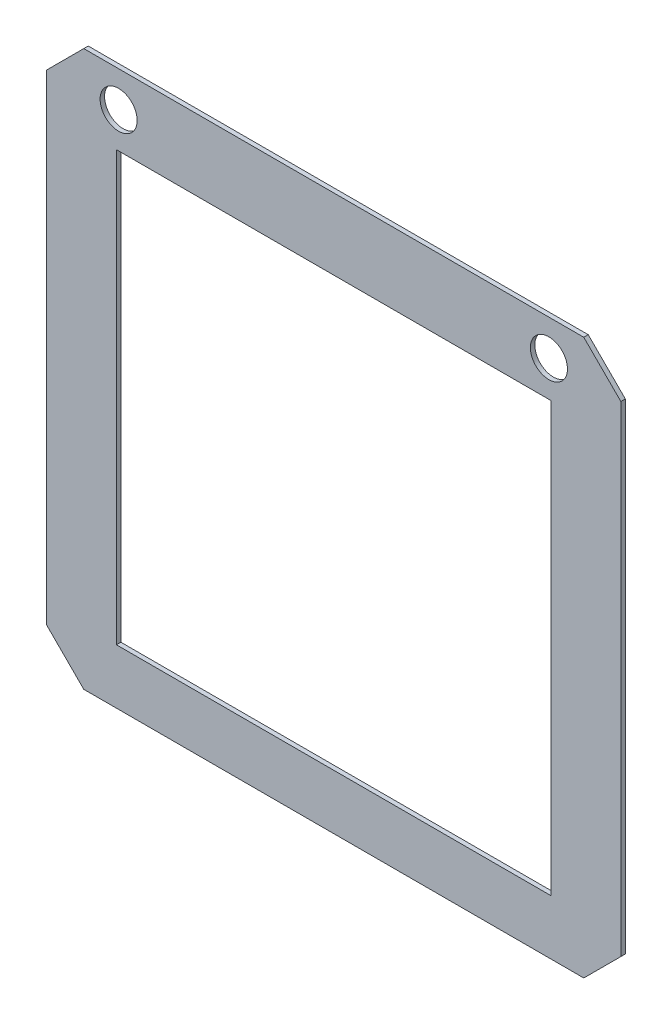
ISO-10303-21;
HEADER;
FILE_DESCRIPTION(('STEP AP214'),'2;1');
FILE_NAME('part.step','',(''),(''),'','','');
FILE_SCHEMA(('AUTOMOTIVE_DESIGN { 1 0 10303 214 1 1 1 1 }'));
ENDSEC;
DATA;
#1=APPLICATION_CONTEXT('core data for automotive mechanical design processes');
#2=APPLICATION_PROTOCOL_DEFINITION('international standard','automotive_design',2000,#1);
#3=PRODUCT_CONTEXT('',#1,'mechanical');
#4=PRODUCT('Part','Part','',(#3));
#5=PRODUCT_RELATED_PRODUCT_CATEGORY('part','',(#4));
#6=PRODUCT_DEFINITION_FORMATION('','',#4);
#7=PRODUCT_DEFINITION_CONTEXT('part definition',#1,'design');
#8=PRODUCT_DEFINITION('design','',#6,#7);
#9=PRODUCT_DEFINITION_SHAPE('','',#8);
#10=(LENGTH_UNIT() NAMED_UNIT(*) SI_UNIT(.MILLI.,.METRE.));
#11=(NAMED_UNIT(*) PLANE_ANGLE_UNIT() SI_UNIT($,.RADIAN.));
#12=(NAMED_UNIT(*) SI_UNIT($,.STERADIAN.) SOLID_ANGLE_UNIT());
#13=UNCERTAINTY_MEASURE_WITH_UNIT(LENGTH_MEASURE(1.E-05),#10,'distance_accuracy_value','');
#14=(GEOMETRIC_REPRESENTATION_CONTEXT(3) GLOBAL_UNCERTAINTY_ASSIGNED_CONTEXT((#13)) GLOBAL_UNIT_ASSIGNED_CONTEXT((#10,
#11,#12)) REPRESENTATION_CONTEXT('',''));
#15=CARTESIAN_POINT('',(0.,0.,0.));
#16=DIRECTION('',(0.,0.,1.));
#17=DIRECTION('',(1.,0.,0.));
#18=AXIS2_PLACEMENT_3D('',#15,#16,#17);
#19=CARTESIAN_POINT('',(0.,0.,3.));
#20=DIRECTION('',(0.,0.,-1.));
#21=DIRECTION('',(-1.,0.,0.));
#22=AXIS2_PLACEMENT_3D('',#19,#20,#21);
#23=PLANE('',#22);
#24=CARTESIAN_POINT('',(-145.,163.,3.));
#25=DIRECTION('',(0.,0.,1.));
#26=DIRECTION('',(1.,0.,0.));
#27=AXIS2_PLACEMENT_3D('',#24,#25,#26);
#28=CIRCLE('',#27,12.5);
#29=CARTESIAN_POINT('',(-132.5,163.,3.));
#30=VERTEX_POINT('',#29);
#31=EDGE_CURVE('E442',#30,#30,#28,.T.);
#32=ORIENTED_EDGE('',*,*,#31,.F.);
#33=EDGE_LOOP('',(#32));
#34=FACE_BOUND('',#33,.T.);
#35=CARTESIAN_POINT('',(145.,163.,3.));
#36=DIRECTION('',(0.,0.,1.));
#37=DIRECTION('',(1.,0.,0.));
#38=AXIS2_PLACEMENT_3D('',#35,#36,#37);
#39=CIRCLE('',#38,12.5);
#40=CARTESIAN_POINT('',(157.5,163.,3.));
#41=VERTEX_POINT('',#40);
#42=EDGE_CURVE('E443',#41,#41,#39,.T.);
#43=ORIENTED_EDGE('',*,*,#42,.F.);
#44=EDGE_LOOP('',(#43));
#45=FACE_BOUND('',#44,.T.);
#46=DIRECTION('',(0.,-1.,0.));
#47=VECTOR('',#46,1.);
#48=CARTESIAN_POINT('',(-193.5,-187.,3.));
#49=LINE('',#48,#47);
#50=CARTESIAN_POINT('',(-193.5,162.,3.));
#51=VERTEX_POINT('',#50);
#52=CARTESIAN_POINT('',(-193.5,-162.,3.));
#53=VERTEX_POINT('',#52);
#54=EDGE_CURVE('E179',#51,#53,#49,.T.);
#55=ORIENTED_EDGE('',*,*,#54,.T.);
#56=DIRECTION('',(-0.707106781186546,0.707106781186549,0.));
#57=VECTOR('',#56,1.);
#58=CARTESIAN_POINT('',(-168.5,-187.,3.));
#59=LINE('',#58,#57);
#60=CARTESIAN_POINT('',(-168.5,-187.,3.));
#61=VERTEX_POINT('',#60);
#62=EDGE_CURVE('E217',#53,#61,#59,.F.);
#63=ORIENTED_EDGE('',*,*,#62,.T.);
#64=DIRECTION('',(1.,0.,0.));
#65=VECTOR('',#64,1.);
#66=CARTESIAN_POINT('',(-193.5,-187.,3.));
#67=LINE('',#66,#65);
#68=CARTESIAN_POINT('',(168.5,-187.,3.));
#69=VERTEX_POINT('',#68);
#70=EDGE_CURVE('E182',#61,#69,#67,.T.);
#71=ORIENTED_EDGE('',*,*,#70,.T.);
#72=DIRECTION('',(-0.707106781186549,-0.707106781186546,0.));
#73=VECTOR('',#72,1.);
#74=CARTESIAN_POINT('',(193.5,-162.,3.));
#75=LINE('',#74,#73);
#76=CARTESIAN_POINT('',(193.5,-162.,3.));
#77=VERTEX_POINT('',#76);
#78=EDGE_CURVE('E215',#69,#77,#75,.F.);
#79=ORIENTED_EDGE('',*,*,#78,.T.);
#80=DIRECTION('',(0.,1.,0.));
#81=VECTOR('',#80,1.);
#82=CARTESIAN_POINT('',(193.5,-187.,3.));
#83=LINE('',#82,#81);
#84=CARTESIAN_POINT('',(193.5,162.,3.));
#85=VERTEX_POINT('',#84);
#86=EDGE_CURVE('E174',#77,#85,#83,.T.);
#87=ORIENTED_EDGE('',*,*,#86,.T.);
#88=DIRECTION('',(0.707106781186547,-0.707106781186548,0.));
#89=VECTOR('',#88,1.);
#90=CARTESIAN_POINT('',(168.5,187.,3.));
#91=LINE('',#90,#89);
#92=CARTESIAN_POINT('',(168.5,187.,3.));
#93=VERTEX_POINT('',#92);
#94=EDGE_CURVE('E61',#85,#93,#91,.F.);
#95=ORIENTED_EDGE('',*,*,#94,.T.);
#96=DIRECTION('',(-1.,0.,0.));
#97=VECTOR('',#96,1.);
#98=CARTESIAN_POINT('',(-193.5,187.,3.));
#99=LINE('',#98,#97);
#100=CARTESIAN_POINT('',(-168.5,187.,3.));
#101=VERTEX_POINT('',#100);
#102=EDGE_CURVE('E176',#93,#101,#99,.T.);
#103=ORIENTED_EDGE('',*,*,#102,.T.);
#104=DIRECTION('',(0.707106781186549,0.707106781186546,0.));
#105=VECTOR('',#104,1.);
#106=CARTESIAN_POINT('',(-193.5,162.,3.));
#107=LINE('',#106,#105);
#108=EDGE_CURVE('E212',#101,#51,#107,.F.);
#109=ORIENTED_EDGE('',*,*,#108,.T.);
#110=EDGE_LOOP('',(#55,#63,#71,#79,#87,#95,#103,#109));
#111=FACE_BOUND('',#110,.T.);
#112=DIRECTION('',(0.,-1.,0.));
#113=VECTOR('',#112,1.);
#114=CARTESIAN_POINT('',(-146.5,-150.,3.));
#115=LINE('',#114,#113);
#116=CARTESIAN_POINT('',(-146.5,139.,3.));
#117=VERTEX_POINT('',#116);
#118=CARTESIAN_POINT('',(-146.5,-150.,3.));
#119=VERTEX_POINT('',#118);
#120=EDGE_CURVE('E131',#117,#119,#115,.T.);
#121=ORIENTED_EDGE('',*,*,#120,.F.);
#122=DIRECTION('',(-1.,0.,0.));
#123=VECTOR('',#122,1.);
#124=CARTESIAN_POINT('',(-146.5,139.,3.));
#125=LINE('',#124,#123);
#126=CARTESIAN_POINT('',(146.5,139.,3.));
#127=VERTEX_POINT('',#126);
#128=EDGE_CURVE('E156',#127,#117,#125,.T.);
#129=ORIENTED_EDGE('',*,*,#128,.F.);
#130=DIRECTION('',(0.,1.,0.));
#131=VECTOR('',#130,1.);
#132=CARTESIAN_POINT('',(146.5,139.,3.));
#133=LINE('',#132,#131);
#134=CARTESIAN_POINT('',(146.5,-150.,3.));
#135=VERTEX_POINT('',#134);
#136=EDGE_CURVE('E154',#135,#127,#133,.T.);
#137=ORIENTED_EDGE('',*,*,#136,.F.);
#138=DIRECTION('',(1.,0.,0.));
#139=VECTOR('',#138,1.);
#140=CARTESIAN_POINT('',(146.5,-150.,3.));
#141=LINE('',#140,#139);
#142=EDGE_CURVE('E141',#119,#135,#141,.T.);
#143=ORIENTED_EDGE('',*,*,#142,.F.);
#144=EDGE_LOOP('',(#121,#129,#137,#143));
#145=FACE_BOUND('',#144,.T.);
#146=ADVANCED_FACE('F39',(#34,#45,#111,#145),#23,.F.);
#147=CARTESIAN_POINT('',(0.,0.,0.));
#148=DIRECTION('',(0.,0.,-1.));
#149=DIRECTION('',(-1.,0.,0.));
#150=AXIS2_PLACEMENT_3D('',#147,#148,#149);
#151=PLANE('',#150);
#152=CARTESIAN_POINT('',(-145.,163.,0.));
#153=DIRECTION('',(0.,0.,1.));
#154=DIRECTION('',(1.,0.,0.));
#155=AXIS2_PLACEMENT_3D('',#152,#153,#154);
#156=CIRCLE('',#155,12.5);
#157=CARTESIAN_POINT('',(-132.5,163.,0.));
#158=VERTEX_POINT('',#157);
#159=EDGE_CURVE('E163',#158,#158,#156,.T.);
#160=ORIENTED_EDGE('',*,*,#159,.T.);
#161=EDGE_LOOP('',(#160));
#162=FACE_BOUND('',#161,.T.);
#163=CARTESIAN_POINT('',(145.,163.,0.));
#164=DIRECTION('',(0.,0.,1.));
#165=DIRECTION('',(1.,0.,0.));
#166=AXIS2_PLACEMENT_3D('',#163,#164,#165);
#167=CIRCLE('',#166,12.5);
#168=CARTESIAN_POINT('',(157.5,163.,0.));
#169=VERTEX_POINT('',#168);
#170=EDGE_CURVE('E447',#169,#169,#167,.T.);
#171=ORIENTED_EDGE('',*,*,#170,.T.);
#172=EDGE_LOOP('',(#171));
#173=FACE_BOUND('',#172,.T.);
#174=DIRECTION('',(1.,0.,0.));
#175=VECTOR('',#174,1.);
#176=CARTESIAN_POINT('',(-193.5,-187.,0.));
#177=LINE('',#176,#175);
#178=CARTESIAN_POINT('',(-168.5,-187.,0.));
#179=VERTEX_POINT('',#178);
#180=CARTESIAN_POINT('',(168.5,-187.,0.));
#181=VERTEX_POINT('',#180);
#182=EDGE_CURVE('E177',#179,#181,#177,.T.);
#183=ORIENTED_EDGE('',*,*,#182,.F.);
#184=DIRECTION('',(0.707106781186546,-0.707106781186549,0.));
#185=VECTOR('',#184,1.);
#186=CARTESIAN_POINT('',(-177.75,-177.75,0.));
#187=LINE('',#186,#185);
#188=CARTESIAN_POINT('',(-193.5,-162.,0.));
#189=VERTEX_POINT('',#188);
#190=EDGE_CURVE('E205',#179,#189,#187,.F.);
#191=ORIENTED_EDGE('',*,*,#190,.T.);
#192=DIRECTION('',(0.,-1.,0.));
#193=VECTOR('',#192,1.);
#194=CARTESIAN_POINT('',(-193.5,-187.,0.));
#195=LINE('',#194,#193);
#196=CARTESIAN_POINT('',(-193.5,162.,0.));
#197=VERTEX_POINT('',#196);
#198=EDGE_CURVE('E190',#197,#189,#195,.T.);
#199=ORIENTED_EDGE('',*,*,#198,.F.);
#200=DIRECTION('',(-0.707106781186549,-0.707106781186546,0.));
#201=VECTOR('',#200,1.);
#202=CARTESIAN_POINT('',(-177.75,177.75,0.));
#203=LINE('',#202,#201);
#204=CARTESIAN_POINT('',(-168.5,187.,0.));
#205=VERTEX_POINT('',#204);
#206=EDGE_CURVE('E199',#197,#205,#203,.F.);
#207=ORIENTED_EDGE('',*,*,#206,.T.);
#208=DIRECTION('',(-1.,0.,0.));
#209=VECTOR('',#208,1.);
#210=CARTESIAN_POINT('',(-193.5,187.,0.));
#211=LINE('',#210,#209);
#212=CARTESIAN_POINT('',(168.5,187.,0.));
#213=VERTEX_POINT('',#212);
#214=EDGE_CURVE('E188',#213,#205,#211,.T.);
#215=ORIENTED_EDGE('',*,*,#214,.F.);
#216=DIRECTION('',(-0.707106781186547,0.707106781186548,0.));
#217=VECTOR('',#216,1.);
#218=CARTESIAN_POINT('',(177.75,177.75,0.));
#219=LINE('',#218,#217);
#220=CARTESIAN_POINT('',(193.5,162.,0.));
#221=VERTEX_POINT('',#220);
#222=EDGE_CURVE('E201',#213,#221,#219,.F.);
#223=ORIENTED_EDGE('',*,*,#222,.T.);
#224=DIRECTION('',(0.,1.,0.));
#225=VECTOR('',#224,1.);
#226=CARTESIAN_POINT('',(193.5,-187.,0.));
#227=LINE('',#226,#225);
#228=CARTESIAN_POINT('',(193.5,-162.,0.));
#229=VERTEX_POINT('',#228);
#230=EDGE_CURVE('E149',#229,#221,#227,.T.);
#231=ORIENTED_EDGE('',*,*,#230,.F.);
#232=DIRECTION('',(0.707106781186549,0.707106781186546,0.));
#233=VECTOR('',#232,1.);
#234=CARTESIAN_POINT('',(177.75,-177.75,0.));
#235=LINE('',#234,#233);
#236=EDGE_CURVE('E203',#229,#181,#235,.F.);
#237=ORIENTED_EDGE('',*,*,#236,.T.);
#238=EDGE_LOOP('',(#183,#191,#199,#207,#215,#223,#231,#237));
#239=FACE_BOUND('',#238,.T.);
#240=DIRECTION('',(-1.,0.,0.));
#241=VECTOR('',#240,1.);
#242=CARTESIAN_POINT('',(-146.5,139.,0.));
#243=LINE('',#242,#241);
#244=CARTESIAN_POINT('',(146.5,139.,0.));
#245=VERTEX_POINT('',#244);
#246=CARTESIAN_POINT('',(-146.5,139.,0.));
#247=VERTEX_POINT('',#246);
#248=EDGE_CURVE('E142',#245,#247,#243,.T.);
#249=ORIENTED_EDGE('',*,*,#248,.T.);
#250=DIRECTION('',(0.,-1.,0.));
#251=VECTOR('',#250,1.);
#252=CARTESIAN_POINT('',(-146.5,-150.,0.));
#253=LINE('',#252,#251);
#254=CARTESIAN_POINT('',(-146.5,-150.,0.));
#255=VERTEX_POINT('',#254);
#256=EDGE_CURVE('E161',#247,#255,#253,.T.);
#257=ORIENTED_EDGE('',*,*,#256,.T.);
#258=DIRECTION('',(1.,0.,0.));
#259=VECTOR('',#258,1.);
#260=CARTESIAN_POINT('',(146.5,-150.,0.));
#261=LINE('',#260,#259);
#262=CARTESIAN_POINT('',(146.5,-150.,0.));
#263=VERTEX_POINT('',#262);
#264=EDGE_CURVE('E148',#255,#263,#261,.T.);
#265=ORIENTED_EDGE('',*,*,#264,.T.);
#266=DIRECTION('',(0.,1.,0.));
#267=VECTOR('',#266,1.);
#268=CARTESIAN_POINT('',(146.5,139.,0.));
#269=LINE('',#268,#267);
#270=EDGE_CURVE('E165',#263,#245,#269,.T.);
#271=ORIENTED_EDGE('',*,*,#270,.T.);
#272=EDGE_LOOP('',(#249,#257,#265,#271));
#273=FACE_BOUND('',#272,.T.);
#274=ADVANCED_FACE('F233',(#162,#173,#239,#273),#151,.T.);
#275=CARTESIAN_POINT('',(193.5,-187.,3.));
#276=DIRECTION('',(-1.,0.,0.));
#277=DIRECTION('',(0.,0.,1.));
#278=AXIS2_PLACEMENT_3D('',#275,#276,#277);
#279=PLANE('',#278);
#280=ORIENTED_EDGE('',*,*,#86,.F.);
#281=DIRECTION('',(0.,0.,-1.));
#282=VECTOR('',#281,1.);
#283=CARTESIAN_POINT('',(193.5,-162.,3.));
#284=LINE('',#283,#282);
#285=EDGE_CURVE('E221',#77,#229,#284,.T.);
#286=ORIENTED_EDGE('',*,*,#285,.T.);
#287=ORIENTED_EDGE('',*,*,#230,.T.);
#288=DIRECTION('',(0.,0.,1.));
#289=VECTOR('',#288,1.);
#290=CARTESIAN_POINT('',(193.5,162.,3.));
#291=LINE('',#290,#289);
#292=EDGE_CURVE('E219',#221,#85,#291,.T.);
#293=ORIENTED_EDGE('',*,*,#292,.T.);
#294=EDGE_LOOP('',(#280,#286,#287,#293));
#295=FACE_BOUND('',#294,.T.);
#296=ADVANCED_FACE('F227',(#295),#279,.F.);
#297=CARTESIAN_POINT('',(-193.5,187.,3.));
#298=DIRECTION('',(0.,-1.,0.));
#299=DIRECTION('',(0.,0.,-1.));
#300=AXIS2_PLACEMENT_3D('',#297,#298,#299);
#301=PLANE('',#300);
#302=ORIENTED_EDGE('',*,*,#102,.F.);
#303=DIRECTION('',(0.,0.,-1.));
#304=VECTOR('',#303,1.);
#305=CARTESIAN_POINT('',(168.5,187.,3.));
#306=LINE('',#305,#304);
#307=EDGE_CURVE('E11',#93,#213,#306,.T.);
#308=ORIENTED_EDGE('',*,*,#307,.T.);
#309=ORIENTED_EDGE('',*,*,#214,.T.);
#310=DIRECTION('',(0.,0.,1.));
#311=VECTOR('',#310,1.);
#312=CARTESIAN_POINT('',(-168.5,187.,3.));
#313=LINE('',#312,#311);
#314=EDGE_CURVE('E48',#205,#101,#313,.T.);
#315=ORIENTED_EDGE('',*,*,#314,.T.);
#316=EDGE_LOOP('',(#302,#308,#309,#315));
#317=FACE_BOUND('',#316,.T.);
#318=ADVANCED_FACE('F239',(#317),#301,.F.);
#319=CARTESIAN_POINT('',(-193.5,-187.,3.));
#320=DIRECTION('',(1.,0.,0.));
#321=DIRECTION('',(0.,0.,-1.));
#322=AXIS2_PLACEMENT_3D('',#319,#320,#321);
#323=PLANE('',#322);
#324=ORIENTED_EDGE('',*,*,#198,.T.);
#325=DIRECTION('',(0.,0.,1.));
#326=VECTOR('',#325,1.);
#327=CARTESIAN_POINT('',(-193.5,-162.,3.));
#328=LINE('',#327,#326);
#329=EDGE_CURVE('E210',#189,#53,#328,.T.);
#330=ORIENTED_EDGE('',*,*,#329,.T.);
#331=ORIENTED_EDGE('',*,*,#54,.F.);
#332=DIRECTION('',(0.,0.,-1.));
#333=VECTOR('',#332,1.);
#334=CARTESIAN_POINT('',(-193.5,162.,3.));
#335=LINE('',#334,#333);
#336=EDGE_CURVE('E207',#51,#197,#335,.T.);
#337=ORIENTED_EDGE('',*,*,#336,.T.);
#338=EDGE_LOOP('',(#324,#330,#331,#337));
#339=FACE_BOUND('',#338,.T.);
#340=ADVANCED_FACE('F246',(#339),#323,.F.);
#341=CARTESIAN_POINT('',(-193.5,-187.,3.));
#342=DIRECTION('',(0.,1.,0.));
#343=DIRECTION('',(0.,0.,1.));
#344=AXIS2_PLACEMENT_3D('',#341,#342,#343);
#345=PLANE('',#344);
#346=ORIENTED_EDGE('',*,*,#70,.F.);
#347=DIRECTION('',(0.,0.,-1.));
#348=VECTOR('',#347,1.);
#349=CARTESIAN_POINT('',(-168.5,-187.,3.));
#350=LINE('',#349,#348);
#351=EDGE_CURVE('E196',#61,#179,#350,.T.);
#352=ORIENTED_EDGE('',*,*,#351,.T.);
#353=ORIENTED_EDGE('',*,*,#182,.T.);
#354=DIRECTION('',(0.,0.,1.));
#355=VECTOR('',#354,1.);
#356=CARTESIAN_POINT('',(168.5,-187.,3.));
#357=LINE('',#356,#355);
#358=EDGE_CURVE('E185',#181,#69,#357,.T.);
#359=ORIENTED_EDGE('',*,*,#358,.T.);
#360=EDGE_LOOP('',(#346,#352,#353,#359));
#361=FACE_BOUND('',#360,.T.);
#362=ADVANCED_FACE('F254',(#361),#345,.F.);
#363=CARTESIAN_POINT('',(-146.5,-150.,3.));
#364=DIRECTION('',(1.,0.,0.));
#365=DIRECTION('',(0.,0.,-1.));
#366=AXIS2_PLACEMENT_3D('',#363,#364,#365);
#367=PLANE('',#366);
#368=ORIENTED_EDGE('',*,*,#256,.F.);
#369=DIRECTION('',(0.,0.,-1.));
#370=VECTOR('',#369,1.);
#371=CARTESIAN_POINT('',(-146.5,139.,3.));
#372=LINE('',#371,#370);
#373=EDGE_CURVE('E137',#117,#247,#372,.T.);
#374=ORIENTED_EDGE('',*,*,#373,.F.);
#375=ORIENTED_EDGE('',*,*,#120,.T.);
#376=DIRECTION('',(0.,0.,-1.));
#377=VECTOR('',#376,1.);
#378=CARTESIAN_POINT('',(-146.5,-150.,3.));
#379=LINE('',#378,#377);
#380=EDGE_CURVE('E134',#119,#255,#379,.T.);
#381=ORIENTED_EDGE('',*,*,#380,.T.);
#382=EDGE_LOOP('',(#368,#374,#375,#381));
#383=FACE_BOUND('',#382,.T.);
#384=ADVANCED_FACE('F133',(#383),#367,.T.);
#385=CARTESIAN_POINT('',(146.5,-150.,3.));
#386=DIRECTION('',(0.,1.,0.));
#387=DIRECTION('',(-1.,0.,0.));
#388=AXIS2_PLACEMENT_3D('',#385,#386,#387);
#389=PLANE('',#388);
#390=ORIENTED_EDGE('',*,*,#264,.F.);
#391=ORIENTED_EDGE('',*,*,#380,.F.);
#392=ORIENTED_EDGE('',*,*,#142,.T.);
#393=DIRECTION('',(0.,0.,-1.));
#394=VECTOR('',#393,1.);
#395=CARTESIAN_POINT('',(146.5,-150.,3.));
#396=LINE('',#395,#394);
#397=EDGE_CURVE('E150',#135,#263,#396,.T.);
#398=ORIENTED_EDGE('',*,*,#397,.T.);
#399=EDGE_LOOP('',(#390,#391,#392,#398));
#400=FACE_BOUND('',#399,.T.);
#401=ADVANCED_FACE('F145',(#400),#389,.T.);
#402=CARTESIAN_POINT('',(146.5,139.,3.));
#403=DIRECTION('',(-1.,0.,0.));
#404=DIRECTION('',(0.,-1.,0.));
#405=AXIS2_PLACEMENT_3D('',#402,#403,#404);
#406=PLANE('',#405);
#407=ORIENTED_EDGE('',*,*,#270,.F.);
#408=ORIENTED_EDGE('',*,*,#397,.F.);
#409=ORIENTED_EDGE('',*,*,#136,.T.);
#410=DIRECTION('',(0.,0.,-1.));
#411=VECTOR('',#410,1.);
#412=CARTESIAN_POINT('',(146.5,139.,3.));
#413=LINE('',#412,#411);
#414=EDGE_CURVE('E171',#127,#245,#413,.T.);
#415=ORIENTED_EDGE('',*,*,#414,.T.);
#416=EDGE_LOOP('',(#407,#408,#409,#415));
#417=FACE_BOUND('',#416,.T.);
#418=ADVANCED_FACE('F325',(#417),#406,.T.);
#419=CARTESIAN_POINT('',(-146.5,139.,3.));
#420=DIRECTION('',(0.,-1.,0.));
#421=DIRECTION('',(0.,0.,-1.));
#422=AXIS2_PLACEMENT_3D('',#419,#420,#421);
#423=PLANE('',#422);
#424=ORIENTED_EDGE('',*,*,#248,.F.);
#425=ORIENTED_EDGE('',*,*,#414,.F.);
#426=ORIENTED_EDGE('',*,*,#128,.T.);
#427=ORIENTED_EDGE('',*,*,#373,.T.);
#428=EDGE_LOOP('',(#424,#425,#426,#427));
#429=FACE_BOUND('',#428,.T.);
#430=ADVANCED_FACE('F263',(#429),#423,.T.);
#431=CARTESIAN_POINT('',(-168.5,-187.,3.));
#432=DIRECTION('',(0.707106781186549,0.707106781186546,0.));
#433=DIRECTION('',(0.,0.,-1.));
#434=AXIS2_PLACEMENT_3D('',#431,#432,#433);
#435=PLANE('',#434);
#436=ORIENTED_EDGE('',*,*,#62,.F.);
#437=ORIENTED_EDGE('',*,*,#329,.F.);
#438=ORIENTED_EDGE('',*,*,#190,.F.);
#439=ORIENTED_EDGE('',*,*,#351,.F.);
#440=EDGE_LOOP('',(#436,#437,#438,#439));
#441=FACE_BOUND('',#440,.T.);
#442=ADVANCED_FACE('F251',(#441),#435,.F.);
#443=CARTESIAN_POINT('',(193.5,-162.,3.));
#444=DIRECTION('',(-0.707106781186546,0.707106781186549,0.));
#445=DIRECTION('',(0.,0.,-1.));
#446=AXIS2_PLACEMENT_3D('',#443,#444,#445);
#447=PLANE('',#446);
#448=ORIENTED_EDGE('',*,*,#78,.F.);
#449=ORIENTED_EDGE('',*,*,#358,.F.);
#450=ORIENTED_EDGE('',*,*,#236,.F.);
#451=ORIENTED_EDGE('',*,*,#285,.F.);
#452=EDGE_LOOP('',(#448,#449,#450,#451));
#453=FACE_BOUND('',#452,.T.);
#454=ADVANCED_FACE('F256',(#453),#447,.F.);
#455=CARTESIAN_POINT('',(168.5,187.,3.));
#456=DIRECTION('',(-0.707106781186548,-0.707106781186547,0.));
#457=DIRECTION('',(0.,0.,-1.));
#458=AXIS2_PLACEMENT_3D('',#455,#456,#457);
#459=PLANE('',#458);
#460=ORIENTED_EDGE('',*,*,#94,.F.);
#461=ORIENTED_EDGE('',*,*,#292,.F.);
#462=ORIENTED_EDGE('',*,*,#222,.F.);
#463=ORIENTED_EDGE('',*,*,#307,.F.);
#464=EDGE_LOOP('',(#460,#461,#462,#463));
#465=FACE_BOUND('',#464,.T.);
#466=ADVANCED_FACE('F238',(#465),#459,.F.);
#467=CARTESIAN_POINT('',(-193.5,162.,3.));
#468=DIRECTION('',(0.707106781186546,-0.707106781186549,0.));
#469=DIRECTION('',(0.,0.,-1.));
#470=AXIS2_PLACEMENT_3D('',#467,#468,#469);
#471=PLANE('',#470);
#472=ORIENTED_EDGE('',*,*,#108,.F.);
#473=ORIENTED_EDGE('',*,*,#314,.F.);
#474=ORIENTED_EDGE('',*,*,#206,.F.);
#475=ORIENTED_EDGE('',*,*,#336,.F.);
#476=EDGE_LOOP('',(#472,#473,#474,#475));
#477=FACE_BOUND('',#476,.T.);
#478=ADVANCED_FACE('F42',(#477),#471,.F.);
#479=CARTESIAN_POINT('',(145.,163.,0.));
#480=DIRECTION('',(0.,0.,1.));
#481=DIRECTION('',(1.,0.,0.));
#482=AXIS2_PLACEMENT_3D('',#479,#480,#481);
#483=CYLINDRICAL_SURFACE('',#482,12.5);
#484=ORIENTED_EDGE('',*,*,#170,.F.);
#485=EDGE_LOOP('',(#484));
#486=FACE_BOUND('',#485,.T.);
#487=ORIENTED_EDGE('',*,*,#42,.T.);
#488=EDGE_LOOP('',(#487));
#489=FACE_BOUND('',#488,.T.);
#490=ADVANCED_FACE('F362',(#486,#489),#483,.F.);
#491=CARTESIAN_POINT('',(-145.,163.,0.));
#492=DIRECTION('',(0.,0.,1.));
#493=DIRECTION('',(1.,0.,0.));
#494=AXIS2_PLACEMENT_3D('',#491,#492,#493);
#495=CYLINDRICAL_SURFACE('',#494,12.5);
#496=ORIENTED_EDGE('',*,*,#159,.F.);
#497=EDGE_LOOP('',(#496));
#498=FACE_BOUND('',#497,.T.);
#499=ORIENTED_EDGE('',*,*,#31,.T.);
#500=EDGE_LOOP('',(#499));
#501=FACE_BOUND('',#500,.T.);
#502=ADVANCED_FACE('F382',(#498,#501),#495,.F.);
#503=CLOSED_SHELL('',(#146,#274,#296,#318,#340,#362,#384,#401,#418,#430,#442,#454,#466,#478,
#490,#502));
#504=MANIFOLD_SOLID_BREP('B2',#503);
#505=ADVANCED_BREP_SHAPE_REPRESENTATION('',(#18,#504),#14);
#506=SHAPE_DEFINITION_REPRESENTATION(#9,#505);
ENDSEC;
END-ISO-10303-21;
